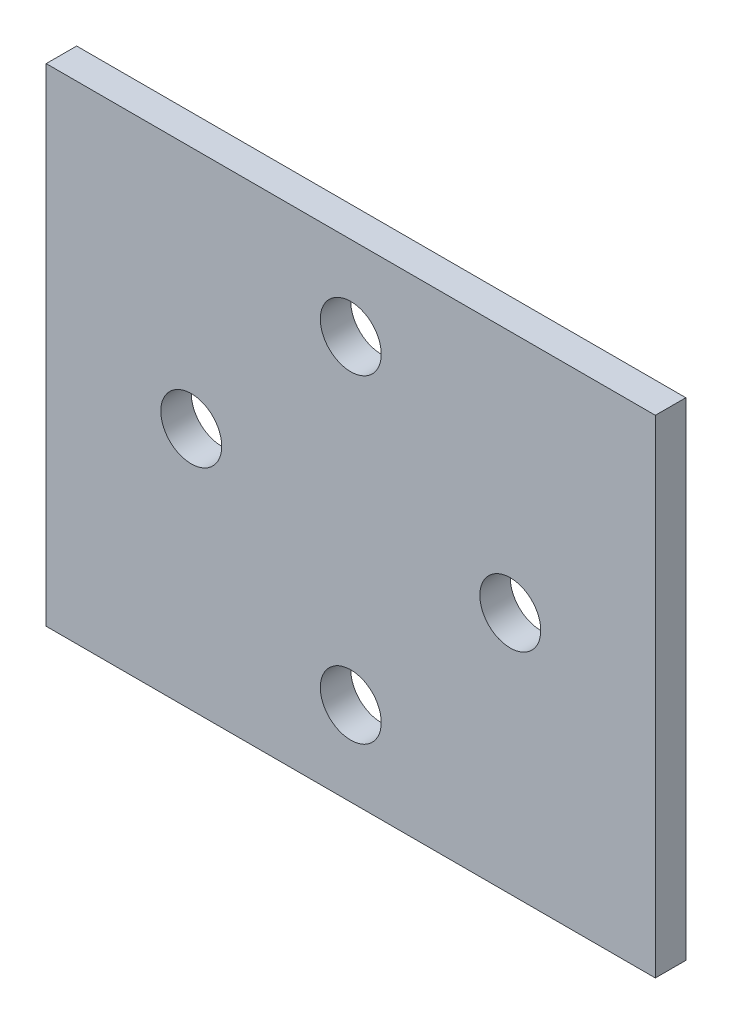
ISO-10303-21;
HEADER;
FILE_DESCRIPTION(('STEP AP214'),'2;1');
FILE_NAME('part.step','',(''),(''),'','','');
FILE_SCHEMA(('AUTOMOTIVE_DESIGN { 1 0 10303 214 1 1 1 1 }'));
ENDSEC;
DATA;
#1=APPLICATION_CONTEXT('core data for automotive mechanical design processes');
#2=APPLICATION_PROTOCOL_DEFINITION('international standard','automotive_design',2000,#1);
#3=PRODUCT_CONTEXT('',#1,'mechanical');
#4=PRODUCT('Part','Part','',(#3));
#5=PRODUCT_RELATED_PRODUCT_CATEGORY('part','',(#4));
#6=PRODUCT_DEFINITION_FORMATION('','',#4);
#7=PRODUCT_DEFINITION_CONTEXT('part definition',#1,'design');
#8=PRODUCT_DEFINITION('design','',#6,#7);
#9=PRODUCT_DEFINITION_SHAPE('','',#8);
#10=(LENGTH_UNIT() NAMED_UNIT(*) SI_UNIT(.MILLI.,.METRE.));
#11=(NAMED_UNIT(*) PLANE_ANGLE_UNIT() SI_UNIT($,.RADIAN.));
#12=(NAMED_UNIT(*) SI_UNIT($,.STERADIAN.) SOLID_ANGLE_UNIT());
#13=UNCERTAINTY_MEASURE_WITH_UNIT(LENGTH_MEASURE(1.E-05),#10,'distance_accuracy_value','');
#14=(GEOMETRIC_REPRESENTATION_CONTEXT(3) GLOBAL_UNCERTAINTY_ASSIGNED_CONTEXT((#13)) GLOBAL_UNIT_ASSIGNED_CONTEXT((#10,
#11,#12)) REPRESENTATION_CONTEXT('',''));
#15=CARTESIAN_POINT('',(0.,0.,0.));
#16=DIRECTION('',(0.,0.,1.));
#17=DIRECTION('',(1.,0.,0.));
#18=AXIS2_PLACEMENT_3D('',#15,#16,#17);
#19=CARTESIAN_POINT('',(50.,0.,-5.));
#20=DIRECTION('',(-1.,0.,0.));
#21=DIRECTION('',(0.,-1.,0.));
#22=AXIS2_PLACEMENT_3D('',#19,#20,#21);
#23=PLANE('',#22);
#24=DIRECTION('',(0.,-1.,0.));
#25=VECTOR('',#24,1.);
#26=CARTESIAN_POINT('',(50.,0.,0.));
#27=LINE('',#26,#25);
#28=CARTESIAN_POINT('',(50.,40.,0.));
#29=VERTEX_POINT('',#28);
#30=CARTESIAN_POINT('',(50.,-40.,0.));
#31=VERTEX_POINT('',#30);
#32=EDGE_CURVE('E114',#29,#31,#27,.T.);
#33=ORIENTED_EDGE('',*,*,#32,.T.);
#34=DIRECTION('',(0.,0.,1.));
#35=VECTOR('',#34,1.);
#36=CARTESIAN_POINT('',(50.,-40.,-5.));
#37=LINE('',#36,#35);
#38=CARTESIAN_POINT('',(50.,-40.,-5.));
#39=VERTEX_POINT('',#38);
#40=EDGE_CURVE('E11',#39,#31,#37,.T.);
#41=ORIENTED_EDGE('',*,*,#40,.F.);
#42=DIRECTION('',(0.,-1.,0.));
#43=VECTOR('',#42,1.);
#44=CARTESIAN_POINT('',(50.,0.,-5.));
#45=LINE('',#44,#43);
#46=CARTESIAN_POINT('',(50.,40.,-5.));
#47=VERTEX_POINT('',#46);
#48=EDGE_CURVE('E57',#47,#39,#45,.T.);
#49=ORIENTED_EDGE('',*,*,#48,.F.);
#50=DIRECTION('',(0.,0.,1.));
#51=VECTOR('',#50,1.);
#52=CARTESIAN_POINT('',(50.,40.,-5.));
#53=LINE('',#52,#51);
#54=EDGE_CURVE('E42',#47,#29,#53,.T.);
#55=ORIENTED_EDGE('',*,*,#54,.T.);
#56=EDGE_LOOP('',(#33,#41,#49,#55));
#57=FACE_BOUND('',#56,.T.);
#58=ADVANCED_FACE('F39',(#57),#23,.F.);
#59=CARTESIAN_POINT('',(0.,-40.,-5.));
#60=DIRECTION('',(0.,-1.,0.));
#61=DIRECTION('',(0.,0.,-1.));
#62=AXIS2_PLACEMENT_3D('',#59,#60,#61);
#63=PLANE('',#62);
#64=DIRECTION('',(1.,0.,0.));
#65=VECTOR('',#64,1.);
#66=CARTESIAN_POINT('',(0.,-40.,0.));
#67=LINE('',#66,#65);
#68=CARTESIAN_POINT('',(-50.,-40.,0.));
#69=VERTEX_POINT('',#68);
#70=EDGE_CURVE('E119',#69,#31,#67,.T.);
#71=ORIENTED_EDGE('',*,*,#70,.F.);
#72=DIRECTION('',(0.,0.,1.));
#73=VECTOR('',#72,1.);
#74=CARTESIAN_POINT('',(-50.,-40.,-5.));
#75=LINE('',#74,#73);
#76=CARTESIAN_POINT('',(-50.,-40.,-5.));
#77=VERTEX_POINT('',#76);
#78=EDGE_CURVE('E48',#77,#69,#75,.T.);
#79=ORIENTED_EDGE('',*,*,#78,.F.);
#80=DIRECTION('',(1.,0.,0.));
#81=VECTOR('',#80,1.);
#82=CARTESIAN_POINT('',(0.,-40.,-5.));
#83=LINE('',#82,#81);
#84=EDGE_CURVE('E97',#77,#39,#83,.T.);
#85=ORIENTED_EDGE('',*,*,#84,.T.);
#86=ORIENTED_EDGE('',*,*,#40,.T.);
#87=EDGE_LOOP('',(#71,#79,#85,#86));
#88=FACE_BOUND('',#87,.T.);
#89=ADVANCED_FACE('F150',(#88),#63,.T.);
#90=CARTESIAN_POINT('',(-50.,0.,-5.));
#91=DIRECTION('',(-1.,0.,0.));
#92=DIRECTION('',(0.,0.,1.));
#93=AXIS2_PLACEMENT_3D('',#90,#91,#92);
#94=PLANE('',#93);
#95=DIRECTION('',(0.,-1.,0.));
#96=VECTOR('',#95,1.);
#97=CARTESIAN_POINT('',(-50.,0.,0.));
#98=LINE('',#97,#96);
#99=CARTESIAN_POINT('',(-50.,40.,0.));
#100=VERTEX_POINT('',#99);
#101=EDGE_CURVE('E89',#100,#69,#98,.T.);
#102=ORIENTED_EDGE('',*,*,#101,.F.);
#103=DIRECTION('',(0.,0.,1.));
#104=VECTOR('',#103,1.);
#105=CARTESIAN_POINT('',(-50.,40.,-5.));
#106=LINE('',#105,#104);
#107=CARTESIAN_POINT('',(-50.,40.,-5.));
#108=VERTEX_POINT('',#107);
#109=EDGE_CURVE('E86',#108,#100,#106,.T.);
#110=ORIENTED_EDGE('',*,*,#109,.F.);
#111=DIRECTION('',(0.,-1.,0.));
#112=VECTOR('',#111,1.);
#113=CARTESIAN_POINT('',(-50.,0.,-5.));
#114=LINE('',#113,#112);
#115=EDGE_CURVE('E88',#108,#77,#114,.T.);
#116=ORIENTED_EDGE('',*,*,#115,.T.);
#117=ORIENTED_EDGE('',*,*,#78,.T.);
#118=EDGE_LOOP('',(#102,#110,#116,#117));
#119=FACE_BOUND('',#118,.T.);
#120=ADVANCED_FACE('F87',(#119),#94,.T.);
#121=CARTESIAN_POINT('',(-2.74282845491014E-13,-26.1859097302135,-5.));
#122=DIRECTION('',(0.,0.,1.));
#123=DIRECTION('',(1.,0.,0.));
#124=AXIS2_PLACEMENT_3D('',#121,#122,#123);
#125=CYLINDRICAL_SURFACE('',#124,5.);
#126=CARTESIAN_POINT('',(-2.74282845491014E-13,-26.1859097302135,-5.));
#127=DIRECTION('',(0.,0.,1.));
#128=DIRECTION('',(1.,0.,0.));
#129=AXIS2_PLACEMENT_3D('',#126,#127,#128);
#130=CIRCLE('',#129,5.);
#131=CARTESIAN_POINT('',(4.99999999999973,-26.1859097302135,-5.));
#132=VERTEX_POINT('',#131);
#133=EDGE_CURVE('E108',#132,#132,#130,.T.);
#134=ORIENTED_EDGE('',*,*,#133,.F.);
#135=EDGE_LOOP('',(#134));
#136=FACE_BOUND('',#135,.T.);
#137=CARTESIAN_POINT('',(-2.74282845491014E-13,-26.1859097302135,0.));
#138=DIRECTION('',(0.,0.,1.));
#139=DIRECTION('',(1.,0.,0.));
#140=AXIS2_PLACEMENT_3D('',#137,#138,#139);
#141=CIRCLE('',#140,5.);
#142=CARTESIAN_POINT('',(4.99999999999973,-26.1859097302135,0.));
#143=VERTEX_POINT('',#142);
#144=EDGE_CURVE('E128',#143,#143,#141,.T.);
#145=ORIENTED_EDGE('',*,*,#144,.T.);
#146=EDGE_LOOP('',(#145));
#147=FACE_BOUND('',#146,.T.);
#148=ADVANCED_FACE('F159',(#136,#147),#125,.F.);
#149=CARTESIAN_POINT('',(-26.1859097302135,0.,-5.));
#150=DIRECTION('',(0.,0.,1.));
#151=DIRECTION('',(1.,0.,0.));
#152=AXIS2_PLACEMENT_3D('',#149,#150,#151);
#153=CYLINDRICAL_SURFACE('',#152,5.);
#154=CARTESIAN_POINT('',(-26.1859097302135,0.,-5.));
#155=DIRECTION('',(0.,0.,1.));
#156=DIRECTION('',(1.,0.,0.));
#157=AXIS2_PLACEMENT_3D('',#154,#155,#156);
#158=CIRCLE('',#157,5.);
#159=CARTESIAN_POINT('',(-21.1859097302135,0.,-5.));
#160=VERTEX_POINT('',#159);
#161=EDGE_CURVE('E105',#160,#160,#158,.T.);
#162=ORIENTED_EDGE('',*,*,#161,.F.);
#163=EDGE_LOOP('',(#162));
#164=FACE_BOUND('',#163,.T.);
#165=CARTESIAN_POINT('',(-26.1859097302135,0.,0.));
#166=DIRECTION('',(0.,0.,1.));
#167=DIRECTION('',(1.,0.,0.));
#168=AXIS2_PLACEMENT_3D('',#165,#166,#167);
#169=CIRCLE('',#168,5.);
#170=CARTESIAN_POINT('',(-21.1859097302135,0.,0.));
#171=VERTEX_POINT('',#170);
#172=EDGE_CURVE('E125',#171,#171,#169,.T.);
#173=ORIENTED_EDGE('',*,*,#172,.T.);
#174=EDGE_LOOP('',(#173));
#175=FACE_BOUND('',#174,.T.);
#176=ADVANCED_FACE('F170',(#164,#175),#153,.F.);
#177=CARTESIAN_POINT('',(0.,26.1859097302135,-5.));
#178=DIRECTION('',(0.,0.,1.));
#179=DIRECTION('',(1.,0.,0.));
#180=AXIS2_PLACEMENT_3D('',#177,#178,#179);
#181=CYLINDRICAL_SURFACE('',#180,5.);
#182=CARTESIAN_POINT('',(0.,26.1859097302135,-5.));
#183=DIRECTION('',(0.,0.,1.));
#184=DIRECTION('',(1.,0.,0.));
#185=AXIS2_PLACEMENT_3D('',#182,#183,#184);
#186=CIRCLE('',#185,5.);
#187=CARTESIAN_POINT('',(5.00000000000009,26.1859097302135,-5.));
#188=VERTEX_POINT('',#187);
#189=EDGE_CURVE('E99',#188,#188,#186,.T.);
#190=ORIENTED_EDGE('',*,*,#189,.F.);
#191=EDGE_LOOP('',(#190));
#192=FACE_BOUND('',#191,.T.);
#193=CARTESIAN_POINT('',(0.,26.1859097302135,0.));
#194=DIRECTION('',(0.,0.,1.));
#195=DIRECTION('',(1.,0.,0.));
#196=AXIS2_PLACEMENT_3D('',#193,#194,#195);
#197=CIRCLE('',#196,5.);
#198=CARTESIAN_POINT('',(5.00000000000009,26.1859097302135,0.));
#199=VERTEX_POINT('',#198);
#200=EDGE_CURVE('E122',#199,#199,#197,.T.);
#201=ORIENTED_EDGE('',*,*,#200,.T.);
#202=EDGE_LOOP('',(#201));
#203=FACE_BOUND('',#202,.T.);
#204=ADVANCED_FACE('F162',(#192,#203),#181,.F.);
#205=CARTESIAN_POINT('',(0.,40.,-5.));
#206=DIRECTION('',(0.,-1.,0.));
#207=DIRECTION('',(1.,0.,0.));
#208=AXIS2_PLACEMENT_3D('',#205,#206,#207);
#209=PLANE('',#208);
#210=DIRECTION('',(1.,0.,0.));
#211=VECTOR('',#210,1.);
#212=CARTESIAN_POINT('',(0.,40.,0.));
#213=LINE('',#212,#211);
#214=EDGE_CURVE('E116',#100,#29,#213,.T.);
#215=ORIENTED_EDGE('',*,*,#214,.T.);
#216=ORIENTED_EDGE('',*,*,#54,.F.);
#217=DIRECTION('',(1.,0.,0.));
#218=VECTOR('',#217,1.);
#219=CARTESIAN_POINT('',(0.,40.,-5.));
#220=LINE('',#219,#218);
#221=EDGE_CURVE('E83',#108,#47,#220,.T.);
#222=ORIENTED_EDGE('',*,*,#221,.F.);
#223=ORIENTED_EDGE('',*,*,#109,.T.);
#224=EDGE_LOOP('',(#215,#216,#222,#223));
#225=FACE_BOUND('',#224,.T.);
#226=ADVANCED_FACE('F92',(#225),#209,.F.);
#227=CARTESIAN_POINT('',(26.1859097302135,-1.82855230327343E-13,-5.));
#228=DIRECTION('',(0.,0.,1.));
#229=DIRECTION('',(1.,0.,0.));
#230=AXIS2_PLACEMENT_3D('',#227,#228,#229);
#231=CYLINDRICAL_SURFACE('',#230,5.);
#232=CARTESIAN_POINT('',(26.1859097302135,-1.82855230327343E-13,-5.));
#233=DIRECTION('',(0.,0.,1.));
#234=DIRECTION('',(1.,0.,0.));
#235=AXIS2_PLACEMENT_3D('',#232,#233,#234);
#236=CIRCLE('',#235,5.);
#237=CARTESIAN_POINT('',(31.1859097302135,-1.82855230327343E-13,-5.));
#238=VERTEX_POINT('',#237);
#239=EDGE_CURVE('E111',#238,#238,#236,.T.);
#240=ORIENTED_EDGE('',*,*,#239,.F.);
#241=EDGE_LOOP('',(#240));
#242=FACE_BOUND('',#241,.T.);
#243=CARTESIAN_POINT('',(26.1859097302135,-1.82855230327343E-13,0.));
#244=DIRECTION('',(0.,0.,1.));
#245=DIRECTION('',(1.,0.,0.));
#246=AXIS2_PLACEMENT_3D('',#243,#244,#245);
#247=CIRCLE('',#246,5.);
#248=CARTESIAN_POINT('',(31.1859097302135,-1.82855230327343E-13,0.));
#249=VERTEX_POINT('',#248);
#250=EDGE_CURVE('E131',#249,#249,#247,.T.);
#251=ORIENTED_EDGE('',*,*,#250,.T.);
#252=EDGE_LOOP('',(#251));
#253=FACE_BOUND('',#252,.T.);
#254=ADVANCED_FACE('F136',(#242,#253),#231,.F.);
#255=CARTESIAN_POINT('',(0.,0.,-5.));
#256=DIRECTION('',(0.,0.,1.));
#257=DIRECTION('',(1.,0.,0.));
#258=AXIS2_PLACEMENT_3D('',#255,#256,#257);
#259=PLANE('',#258);
#260=ORIENTED_EDGE('',*,*,#48,.T.);
#261=ORIENTED_EDGE('',*,*,#84,.F.);
#262=ORIENTED_EDGE('',*,*,#115,.F.);
#263=ORIENTED_EDGE('',*,*,#221,.T.);
#264=EDGE_LOOP('',(#260,#261,#262,#263));
#265=FACE_BOUND('',#264,.T.);
#266=ORIENTED_EDGE('',*,*,#189,.T.);
#267=EDGE_LOOP('',(#266));
#268=FACE_BOUND('',#267,.T.);
#269=ORIENTED_EDGE('',*,*,#161,.T.);
#270=EDGE_LOOP('',(#269));
#271=FACE_BOUND('',#270,.T.);
#272=ORIENTED_EDGE('',*,*,#133,.T.);
#273=EDGE_LOOP('',(#272));
#274=FACE_BOUND('',#273,.T.);
#275=ORIENTED_EDGE('',*,*,#239,.T.);
#276=EDGE_LOOP('',(#275));
#277=FACE_BOUND('',#276,.T.);
#278=ADVANCED_FACE('F95',(#265,#268,#271,#274,#277),#259,.F.);
#279=CARTESIAN_POINT('',(0.,0.,0.));
#280=DIRECTION('',(0.,0.,1.));
#281=DIRECTION('',(1.,0.,0.));
#282=AXIS2_PLACEMENT_3D('',#279,#280,#281);
#283=PLANE('',#282);
#284=ORIENTED_EDGE('',*,*,#32,.F.);
#285=ORIENTED_EDGE('',*,*,#214,.F.);
#286=ORIENTED_EDGE('',*,*,#101,.T.);
#287=ORIENTED_EDGE('',*,*,#70,.T.);
#288=EDGE_LOOP('',(#284,#285,#286,#287));
#289=FACE_BOUND('',#288,.T.);
#290=ORIENTED_EDGE('',*,*,#200,.F.);
#291=EDGE_LOOP('',(#290));
#292=FACE_BOUND('',#291,.T.);
#293=ORIENTED_EDGE('',*,*,#172,.F.);
#294=EDGE_LOOP('',(#293));
#295=FACE_BOUND('',#294,.T.);
#296=ORIENTED_EDGE('',*,*,#144,.F.);
#297=EDGE_LOOP('',(#296));
#298=FACE_BOUND('',#297,.T.);
#299=ORIENTED_EDGE('',*,*,#250,.F.);
#300=EDGE_LOOP('',(#299));
#301=FACE_BOUND('',#300,.T.);
#302=ADVANCED_FACE('F138',(#289,#292,#295,#298,#301),#283,.T.);
#303=CLOSED_SHELL('',(#58,#89,#120,#148,#176,#204,#226,#254,#278,#302));
#304=MANIFOLD_SOLID_BREP('B2',#303);
#305=ADVANCED_BREP_SHAPE_REPRESENTATION('',(#18,#304),#14);
#306=SHAPE_DEFINITION_REPRESENTATION(#9,#305);
ENDSEC;
END-ISO-10303-21;
